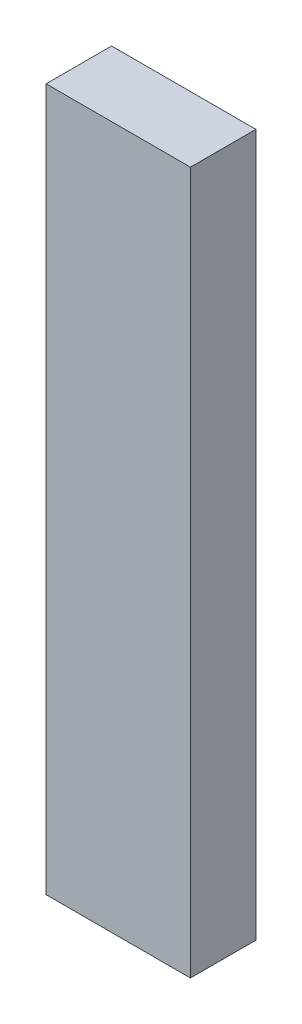
ISO-10303-21;
HEADER;
FILE_DESCRIPTION(('STEP AP214'),'2;1');
FILE_NAME('part.step','',(''),(''),'','','');
FILE_SCHEMA(('AUTOMOTIVE_DESIGN { 1 0 10303 214 1 1 1 1 }'));
ENDSEC;
DATA;
#1=APPLICATION_CONTEXT('core data for automotive mechanical design processes');
#2=APPLICATION_PROTOCOL_DEFINITION('international standard','automotive_design',2000,#1);
#3=PRODUCT_CONTEXT('',#1,'mechanical');
#4=PRODUCT('Part','Part','',(#3));
#5=PRODUCT_RELATED_PRODUCT_CATEGORY('part','',(#4));
#6=PRODUCT_DEFINITION_FORMATION('','',#4);
#7=PRODUCT_DEFINITION_CONTEXT('part definition',#1,'design');
#8=PRODUCT_DEFINITION('design','',#6,#7);
#9=PRODUCT_DEFINITION_SHAPE('','',#8);
#10=(LENGTH_UNIT() NAMED_UNIT(*) SI_UNIT(.MILLI.,.METRE.));
#11=(NAMED_UNIT(*) PLANE_ANGLE_UNIT() SI_UNIT($,.RADIAN.));
#12=(NAMED_UNIT(*) SI_UNIT($,.STERADIAN.) SOLID_ANGLE_UNIT());
#13=UNCERTAINTY_MEASURE_WITH_UNIT(LENGTH_MEASURE(1.E-05),#10,'distance_accuracy_value','');
#14=(GEOMETRIC_REPRESENTATION_CONTEXT(3) GLOBAL_UNCERTAINTY_ASSIGNED_CONTEXT((#13)) GLOBAL_UNIT_ASSIGNED_CONTEXT((#10,
#11,#12)) REPRESENTATION_CONTEXT('',''));
#15=CARTESIAN_POINT('',(0.,0.,0.));
#16=DIRECTION('',(0.,0.,1.));
#17=DIRECTION('',(1.,0.,0.));
#18=AXIS2_PLACEMENT_3D('',#15,#16,#17);
#19=CARTESIAN_POINT('',(0.,262.7,0.));
#20=DIRECTION('',(1.,0.,0.));
#21=DIRECTION('',(0.,0.,-1.));
#22=AXIS2_PLACEMENT_3D('',#19,#20,#21);
#23=PLANE('',#22);
#24=DIRECTION('',(0.,0.,1.));
#25=VECTOR('',#24,1.);
#26=CARTESIAN_POINT('',(0.,0.,0.));
#27=LINE('',#26,#25);
#28=CARTESIAN_POINT('',(0.,0.,-24.5));
#29=VERTEX_POINT('',#28);
#30=CARTESIAN_POINT('',(0.,0.,0.));
#31=VERTEX_POINT('',#30);
#32=EDGE_CURVE('E107',#29,#31,#27,.T.);
#33=ORIENTED_EDGE('',*,*,#32,.T.);
#34=DIRECTION('',(0.,-1.,0.));
#35=VECTOR('',#34,1.);
#36=CARTESIAN_POINT('',(0.,262.7,0.));
#37=LINE('',#36,#35);
#38=CARTESIAN_POINT('',(0.,262.7,0.));
#39=VERTEX_POINT('',#38);
#40=EDGE_CURVE('E11',#39,#31,#37,.T.);
#41=ORIENTED_EDGE('',*,*,#40,.F.);
#42=DIRECTION('',(0.,0.,1.));
#43=VECTOR('',#42,1.);
#44=CARTESIAN_POINT('',(0.,262.7,0.));
#45=LINE('',#44,#43);
#46=CARTESIAN_POINT('',(0.,262.7,-24.5));
#47=VERTEX_POINT('',#46);
#48=EDGE_CURVE('E91',#47,#39,#45,.T.);
#49=ORIENTED_EDGE('',*,*,#48,.F.);
#50=DIRECTION('',(0.,-1.,0.));
#51=VECTOR('',#50,1.);
#52=CARTESIAN_POINT('',(0.,262.7,-24.5));
#53=LINE('',#52,#51);
#54=EDGE_CURVE('E103',#47,#29,#53,.T.);
#55=ORIENTED_EDGE('',*,*,#54,.T.);
#56=EDGE_LOOP('',(#33,#41,#49,#55));
#57=FACE_BOUND('',#56,.T.);
#58=ADVANCED_FACE('F39',(#57),#23,.F.);
#59=CARTESIAN_POINT('',(0.,262.7,0.));
#60=DIRECTION('',(0.,0.,-1.));
#61=DIRECTION('',(-1.,0.,0.));
#62=AXIS2_PLACEMENT_3D('',#59,#60,#61);
#63=PLANE('',#62);
#64=DIRECTION('',(1.,0.,0.));
#65=VECTOR('',#64,1.);
#66=CARTESIAN_POINT('',(0.,0.,0.));
#67=LINE('',#66,#65);
#68=CARTESIAN_POINT('',(54.,0.,0.));
#69=VERTEX_POINT('',#68);
#70=EDGE_CURVE('E96',#31,#69,#67,.T.);
#71=ORIENTED_EDGE('',*,*,#70,.T.);
#72=DIRECTION('',(0.,-1.,0.));
#73=VECTOR('',#72,1.);
#74=CARTESIAN_POINT('',(54.,262.7,0.));
#75=LINE('',#74,#73);
#76=CARTESIAN_POINT('',(54.,262.7,0.));
#77=VERTEX_POINT('',#76);
#78=EDGE_CURVE('E48',#77,#69,#75,.T.);
#79=ORIENTED_EDGE('',*,*,#78,.F.);
#80=DIRECTION('',(1.,0.,0.));
#81=VECTOR('',#80,1.);
#82=CARTESIAN_POINT('',(0.,262.7,0.));
#83=LINE('',#82,#81);
#84=EDGE_CURVE('E86',#39,#77,#83,.T.);
#85=ORIENTED_EDGE('',*,*,#84,.F.);
#86=ORIENTED_EDGE('',*,*,#40,.T.);
#87=EDGE_LOOP('',(#71,#79,#85,#86));
#88=FACE_BOUND('',#87,.T.);
#89=ADVANCED_FACE('F95',(#88),#63,.F.);
#90=CARTESIAN_POINT('',(54.,262.7,0.));
#91=DIRECTION('',(-1.,0.,0.));
#92=DIRECTION('',(0.,0.,1.));
#93=AXIS2_PLACEMENT_3D('',#90,#91,#92);
#94=PLANE('',#93);
#95=DIRECTION('',(0.,0.,-1.));
#96=VECTOR('',#95,1.);
#97=CARTESIAN_POINT('',(54.,0.,0.));
#98=LINE('',#97,#96);
#99=CARTESIAN_POINT('',(54.,0.,-24.5));
#100=VERTEX_POINT('',#99);
#101=EDGE_CURVE('E73',#69,#100,#98,.T.);
#102=ORIENTED_EDGE('',*,*,#101,.T.);
#103=DIRECTION('',(0.,-1.,0.));
#104=VECTOR('',#103,1.);
#105=CARTESIAN_POINT('',(54.,262.7,-24.5));
#106=LINE('',#105,#104);
#107=CARTESIAN_POINT('',(54.,262.7,-24.5));
#108=VERTEX_POINT('',#107);
#109=EDGE_CURVE('E98',#108,#100,#106,.T.);
#110=ORIENTED_EDGE('',*,*,#109,.F.);
#111=DIRECTION('',(0.,0.,-1.));
#112=VECTOR('',#111,1.);
#113=CARTESIAN_POINT('',(54.,262.7,0.));
#114=LINE('',#113,#112);
#115=EDGE_CURVE('E89',#77,#108,#114,.T.);
#116=ORIENTED_EDGE('',*,*,#115,.F.);
#117=ORIENTED_EDGE('',*,*,#78,.T.);
#118=EDGE_LOOP('',(#102,#110,#116,#117));
#119=FACE_BOUND('',#118,.T.);
#120=ADVANCED_FACE('F99',(#119),#94,.F.);
#121=CARTESIAN_POINT('',(0.,262.7,-24.5));
#122=DIRECTION('',(0.,0.,1.));
#123=DIRECTION('',(1.,0.,0.));
#124=AXIS2_PLACEMENT_3D('',#121,#122,#123);
#125=PLANE('',#124);
#126=DIRECTION('',(-1.,0.,0.));
#127=VECTOR('',#126,1.);
#128=CARTESIAN_POINT('',(0.,0.,-24.5));
#129=LINE('',#128,#127);
#130=EDGE_CURVE('E79',#100,#29,#129,.T.);
#131=ORIENTED_EDGE('',*,*,#130,.T.);
#132=ORIENTED_EDGE('',*,*,#54,.F.);
#133=DIRECTION('',(-1.,0.,0.));
#134=VECTOR('',#133,1.);
#135=CARTESIAN_POINT('',(0.,262.7,-24.5));
#136=LINE('',#135,#134);
#137=EDGE_CURVE('E56',#108,#47,#136,.T.);
#138=ORIENTED_EDGE('',*,*,#137,.F.);
#139=ORIENTED_EDGE('',*,*,#109,.T.);
#140=EDGE_LOOP('',(#131,#132,#138,#139));
#141=FACE_BOUND('',#140,.T.);
#142=ADVANCED_FACE('F120',(#141),#125,.F.);
#143=CARTESIAN_POINT('',(0.,262.7,0.));
#144=DIRECTION('',(0.,-1.,0.));
#145=DIRECTION('',(0.,0.,-1.));
#146=AXIS2_PLACEMENT_3D('',#143,#144,#145);
#147=PLANE('',#146);
#148=ORIENTED_EDGE('',*,*,#48,.T.);
#149=ORIENTED_EDGE('',*,*,#84,.T.);
#150=ORIENTED_EDGE('',*,*,#115,.T.);
#151=ORIENTED_EDGE('',*,*,#137,.T.);
#152=EDGE_LOOP('',(#148,#149,#150,#151));
#153=FACE_BOUND('',#152,.T.);
#154=ADVANCED_FACE('F87',(#153),#147,.F.);
#155=CARTESIAN_POINT('',(0.,0.,0.));
#156=DIRECTION('',(0.,-1.,0.));
#157=DIRECTION('',(0.,0.,-1.));
#158=AXIS2_PLACEMENT_3D('',#155,#156,#157);
#159=PLANE('',#158);
#160=ORIENTED_EDGE('',*,*,#32,.F.);
#161=ORIENTED_EDGE('',*,*,#130,.F.);
#162=ORIENTED_EDGE('',*,*,#101,.F.);
#163=ORIENTED_EDGE('',*,*,#70,.F.);
#164=EDGE_LOOP('',(#160,#161,#162,#163));
#165=FACE_BOUND('',#164,.T.);
#166=ADVANCED_FACE('F123',(#165),#159,.T.);
#167=CLOSED_SHELL('',(#58,#89,#120,#142,#154,#166));
#168=MANIFOLD_SOLID_BREP('B2',#167);
#169=ADVANCED_BREP_SHAPE_REPRESENTATION('',(#18,#168),#14);
#170=SHAPE_DEFINITION_REPRESENTATION(#9,#169);
ENDSEC;
END-ISO-10303-21;
